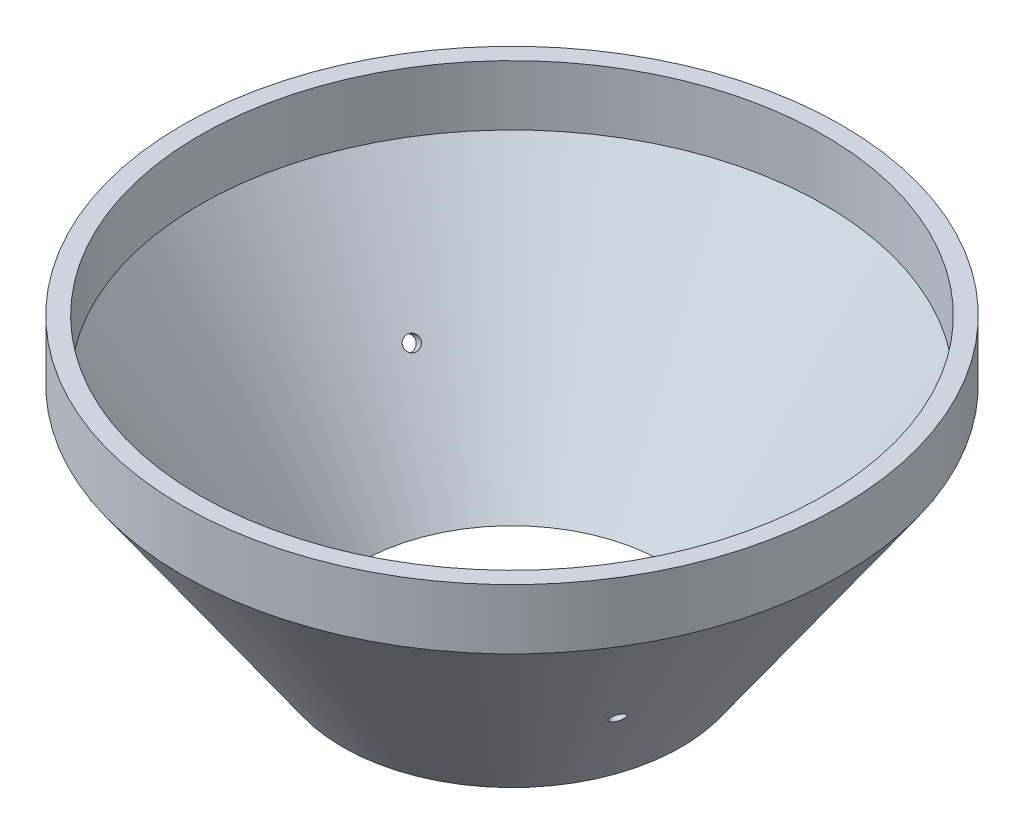
ISO-10303-21;
HEADER;
FILE_DESCRIPTION(('STEP AP214'),'2;1');
FILE_NAME('part.step','',(''),(''),'','','');
FILE_SCHEMA(('AUTOMOTIVE_DESIGN { 1 0 10303 214 1 1 1 1 }'));
ENDSEC;
DATA;
#1=APPLICATION_CONTEXT('core data for automotive mechanical design processes');
#2=APPLICATION_PROTOCOL_DEFINITION('international standard','automotive_design',2000,#1);
#3=PRODUCT_CONTEXT('',#1,'mechanical');
#4=PRODUCT('Part','Part','',(#3));
#5=PRODUCT_RELATED_PRODUCT_CATEGORY('part','',(#4));
#6=PRODUCT_DEFINITION_FORMATION('','',#4);
#7=PRODUCT_DEFINITION_CONTEXT('part definition',#1,'design');
#8=PRODUCT_DEFINITION('design','',#6,#7);
#9=PRODUCT_DEFINITION_SHAPE('','',#8);
#10=(LENGTH_UNIT() NAMED_UNIT(*) SI_UNIT(.MILLI.,.METRE.));
#11=(NAMED_UNIT(*) PLANE_ANGLE_UNIT() SI_UNIT($,.RADIAN.));
#12=(NAMED_UNIT(*) SI_UNIT($,.STERADIAN.) SOLID_ANGLE_UNIT());
#13=UNCERTAINTY_MEASURE_WITH_UNIT(LENGTH_MEASURE(1.E-05),#10,'distance_accuracy_value','');
#14=(GEOMETRIC_REPRESENTATION_CONTEXT(3) GLOBAL_UNCERTAINTY_ASSIGNED_CONTEXT((#13)) GLOBAL_UNIT_ASSIGNED_CONTEXT((#10,
#11,#12)) REPRESENTATION_CONTEXT('',''));
#15=CARTESIAN_POINT('',(0.,0.,0.));
#16=DIRECTION('',(0.,0.,1.));
#17=DIRECTION('',(1.,0.,0.));
#18=AXIS2_PLACEMENT_3D('',#15,#16,#17);
#19=CARTESIAN_POINT('',(0.,5.79928931524201,0.));
#20=DIRECTION('',(0.,1.,0.));
#21=DIRECTION('',(0.,0.,1.));
#22=AXIS2_PLACEMENT_3D('',#19,#20,#21);
#23=PLANE('',#22);
#24=CARTESIAN_POINT('',(0.,5.79928931524201,0.));
#25=DIRECTION('',(0.,-1.,0.));
#26=DIRECTION('',(0.,0.,-1.));
#27=AXIS2_PLACEMENT_3D('',#24,#25,#26);
#28=CIRCLE('',#27,14.0919874006978);
#29=CARTESIAN_POINT('',(0.,5.79928931524201,-14.0919874006978));
#30=VERTEX_POINT('',#29);
#31=EDGE_CURVE('E46',#30,#30,#28,.T.);
#32=ORIENTED_EDGE('',*,*,#31,.T.);
#33=EDGE_LOOP('',(#32));
#34=FACE_BOUND('',#33,.T.);
#35=CARTESIAN_POINT('',(0.,5.79928931524201,0.));
#36=DIRECTION('',(0.,1.,0.));
#37=DIRECTION('',(0.,0.,1.));
#38=AXIS2_PLACEMENT_3D('',#35,#36,#37);
#39=CIRCLE('',#38,12.6270578941841);
#40=CARTESIAN_POINT('',(0.,5.79928931524201,12.6270578941841));
#41=VERTEX_POINT('',#40);
#42=EDGE_CURVE('E50',#41,#41,#39,.F.);
#43=ORIENTED_EDGE('',*,*,#42,.F.);
#44=EDGE_LOOP('',(#43));
#45=FACE_BOUND('',#44,.T.);
#46=ADVANCED_FACE('F33',(#34,#45),#23,.F.);
#47=CARTESIAN_POINT('',(0.,24.8956993484499,0.));
#48=DIRECTION('',(0.,1.,0.));
#49=DIRECTION('',(0.,0.,1.));
#50=AXIS2_PLACEMENT_3D('',#47,#48,#49);
#51=CONICAL_SURFACE('',#50,27.4634376586934,0.610865238198011);
#52=CARTESIAN_POINT('',(-17.5893015558669,14.2993672497077,-9.61096413361605));
#53=CARTESIAN_POINT('',(-17.6035189613711,14.3260236776415,-9.6238708044023));
#54=CARTESIAN_POINT('',(-17.6192554613632,14.3530118601868,-9.63447953581972));
#55=CARTESIAN_POINT('',(-17.6533213465278,14.4068688460513,-9.65078258631254));
#56=CARTESIAN_POINT('',(-17.6716538122646,14.4337374678458,-9.65647100874142));
#57=CARTESIAN_POINT('',(-17.7103672263708,14.4865634435641,-9.66275363933926));
#58=CARTESIAN_POINT('',(-17.7307471865282,14.5125212290129,-9.663350293185));
#59=CARTESIAN_POINT('',(-17.7729644752172,14.5628030126219,-9.65943102159392));
#60=CARTESIAN_POINT('',(-17.7948014448277,14.5871274102116,-9.65491635094159));
#61=CARTESIAN_POINT('',(-17.8393045491599,14.6334809221595,-9.64089410771097));
#62=CARTESIAN_POINT('',(-17.8619708766812,14.6555094981719,-9.63138536721915));
#63=CARTESIAN_POINT('',(-17.9074630256751,14.6966585594308,-9.60763203794173));
#64=CARTESIAN_POINT('',(-17.930288853531,14.7157789275837,-9.59338725854177));
#65=CARTESIAN_POINT('',(-17.9754323914764,14.7505906044923,-9.56055049403012));
#66=CARTESIAN_POINT('',(-17.9977499984155,14.7662812225932,-9.54195763489525));
#67=CARTESIAN_POINT('',(-18.0412163784556,14.7938007318238,-9.50094226255696));
#68=CARTESIAN_POINT('',(-18.0623651543573,14.8056296322071,-9.47851975853055));
#69=CARTESIAN_POINT('',(-18.1028734703736,14.8251037628288,-9.43047335028984));
#70=CARTESIAN_POINT('',(-18.1222331252085,14.8327492614663,-9.40484965158765));
#71=CARTESIAN_POINT('',(-18.1586019426744,14.8436504551491,-9.35112065124473));
#72=CARTESIAN_POINT('',(-18.1756111134505,14.8469061654067,-9.32301535820404));
#73=CARTESIAN_POINT('',(-18.2067863258141,14.8489394102161,-9.26512557139888));
#74=CARTESIAN_POINT('',(-18.2209530627804,14.847718041462,-9.23534149062597));
#75=CARTESIAN_POINT('',(-18.246048606551,14.8408326330705,-9.17493453857342));
#76=CARTESIAN_POINT('',(-18.2569774110083,14.8351685902127,-9.14431166668579));
#77=CARTESIAN_POINT('',(-18.2752962935893,14.8195515994009,-9.08310286903448));
#78=CARTESIAN_POINT('',(-18.2826865417672,14.8095988575947,-9.05251694156582));
#79=CARTESIAN_POINT('',(-18.2937359338752,14.7856744239979,-8.99225655576263));
#80=CARTESIAN_POINT('',(-18.2973950736341,14.7717027277143,-8.96258209844716));
#81=CARTESIAN_POINT('',(-18.300900117043,14.7401167857451,-8.90499047572484));
#82=CARTESIAN_POINT('',(-18.300745170455,14.7225017287474,-8.87707370353265));
#83=CARTESIAN_POINT('',(-18.296648022972,14.6841121545818,-8.82380854343595));
#84=CARTESIAN_POINT('',(-18.2927058176174,14.6633376336937,-8.79846015855581));
#85=CARTESIAN_POINT('',(-18.2811685744619,14.6191964659179,-8.751059338044));
#86=CARTESIAN_POINT('',(-18.2735729813852,14.5958294254108,-8.72900740410549));
#87=CARTESIAN_POINT('',(-18.2549650672113,14.547152436602,-8.68884096571743));
#88=CARTESIAN_POINT('',(-18.243952749952,14.5218424904829,-8.67072645684505));
#89=CARTESIAN_POINT('',(-18.218841797149,14.4699897472089,-8.63896013781421));
#90=CARTESIAN_POINT('',(-18.2047436434253,14.4434471430295,-8.62530763179115));
#91=CARTESIAN_POINT('',(-18.173869366871,14.3898719674803,-8.60285403205953));
#92=CARTESIAN_POINT('',(-18.1570932481387,14.3628393968606,-8.59405293092657));
#93=CARTESIAN_POINT('',(-18.1213447594277,14.3090573027011,-8.58155412537723));
#94=CARTESIAN_POINT('',(-18.1023728914671,14.2823077159827,-8.57785525691703));
#95=CARTESIAN_POINT('',(-18.0627613826868,14.2298501213097,-8.57565832566146));
#96=CARTESIAN_POINT('',(-18.0421217414195,14.2041421136349,-8.57716026426245));
#97=CARTESIAN_POINT('',(-17.9997447380059,14.1545071610063,-8.58531476407548));
#98=CARTESIAN_POINT('',(-17.9780073157683,14.1305803137295,-8.59196760752949));
#99=CARTESIAN_POINT('',(-17.9340319249287,14.0852038831406,-8.61022474784022));
#100=CARTESIAN_POINT('',(-17.9117939552348,14.0637543052344,-8.62182905550154));
#101=CARTESIAN_POINT('',(-17.8674182578462,14.0239544597708,-8.64965118023342));
#102=CARTESIAN_POINT('',(-17.8452805573542,14.0056049893608,-8.66587018103622));
#103=CARTESIAN_POINT('',(-17.8017141995119,13.9725523909275,-8.70244764030438));
#104=CARTESIAN_POINT('',(-17.780285541653,13.9578492602881,-8.7228060958));
#105=CARTESIAN_POINT('',(-17.7387212560724,13.9325241535497,-8.76707446907796));
#106=CARTESIAN_POINT('',(-17.7185856967921,13.9219023933223,-8.79098457462134));
#107=CARTESIAN_POINT('',(-17.6801623775481,13.9050573672074,-8.84166758102289));
#108=CARTESIAN_POINT('',(-17.6618746178109,13.898834101859,-8.86844048223203));
#109=CARTESIAN_POINT('',(-17.6276592744664,13.8909729578077,-8.92407625724281));
#110=CARTESIAN_POINT('',(-17.6117311216332,13.8893339714927,-8.95293862447736));
#111=CARTESIAN_POINT('',(-17.582678972686,13.8906872501671,-9.01193798450284));
#112=CARTESIAN_POINT('',(-17.5695549792523,13.8936795195828,-9.042074978512));
#113=CARTESIAN_POINT('',(-17.546490868914,13.9042050889841,-9.10276646151237));
#114=CARTESIAN_POINT('',(-17.5365503196698,13.9117377719408,-9.13332089322371));
#115=CARTESIAN_POINT('',(-17.5201463873378,13.9311186399565,-9.19398997318723));
#116=CARTESIAN_POINT('',(-17.5136828729936,13.9429666620852,-9.22410463799862));
#117=CARTESIAN_POINT('',(-17.5044349174837,13.9706270414056,-9.28305339933476));
#118=CARTESIAN_POINT('',(-17.5016507439055,13.9864396868331,-9.31188740257341));
#119=CARTESIAN_POINT('',(-17.499865193245,14.0215668326574,-9.36747457159952));
#120=CARTESIAN_POINT('',(-17.5008647571347,14.0408822030045,-9.39422721808912));
#121=CARTESIAN_POINT('',(-17.5066459671973,14.0824558180808,-9.44491339057935));
#122=CARTESIAN_POINT('',(-17.5114302677993,14.1047161191121,-9.46884492444918));
#123=CARTESIAN_POINT('',(-17.5246699881199,14.1515029739417,-9.51317992771398));
#124=CARTESIAN_POINT('',(-17.5331210035721,14.1760267811994,-9.53358758881745));
#125=CARTESIAN_POINT('',(-17.5496577154641,14.2171697450197,-9.56346074164448));
#126=CARTESIAN_POINT('',(-17.5567032411223,14.2333242202383,-9.5741678937775));
#127=CARTESIAN_POINT('',(-17.5720672269729,14.2660647242499,-9.59387264243736));
#128=CARTESIAN_POINT('',(-17.5803856871569,14.2826507530401,-9.60287023897548));
#129=CARTESIAN_POINT('',(-17.5893015558669,14.2993672497077,-9.61096413361605));
#130=B_SPLINE_CURVE_WITH_KNOTS('',3,(#52,#53,#54,#55,#56,#57,#58,#59,#60,#61,#62,#63,#64,#65,
#66,#67,#68,#69,#70,#71,#72,#73,#74,#75,#76,#77,#78,#79,#80,#81,#82,#83,#84,#85,#86,#87,#88,#89,
#90,#91,#92,#93,#94,#95,#96,#97,#98,#99,#100,#101,#102,#103,#104,#105,#106,#107,#108,#109,#110,
#111,#112,#113,#114,#115,#116,#117,#118,#119,#120,#121,#122,#123,#124,#125,#126,#127,#128,#129),
.UNSPECIFIED.,.T.,.F.,(4,2,2,2,2,2,2,2,2,2,2,2,2,2,2,2,2,2,2,2,2,2,2,2,2,2,2,2,2,2,2,2,2,2,2,2,
2,2,4),(0.,0.0984820921772583,0.197082045382401,0.295634636419945,0.394163038921912,
0.492714493549843,0.591269915121153,0.689845164727733,0.788420178121206,0.886988866388851,
0.985557213076688,1.08410141632164,1.1826456909979,1.28118522940693,1.37972487798188,
1.47828649326707,1.57684822461118,1.67542494101506,1.77400154668906,1.87256277166049,
1.97112384579736,2.06966243009446,2.16820104084814,2.26674505137172,2.36528927692956,
2.46385880326101,2.56242825887658,2.66100292730707,2.75957760782232,2.85812846955568,
2.95667942548179,3.0552169916423,3.15375083779654,3.25229184963217,3.35085736909455,
3.44949207894288,3.5480086404969,3.60976768715793,3.67152673341123),.UNSPECIFIED.);
#131=CARTESIAN_POINT('',(-17.5893015558669,14.2993672497077,-9.61096413361605));
#132=VERTEX_POINT('',#131);
#133=EDGE_CURVE('E10',#132,#132,#130,.T.);
#134=ORIENTED_EDGE('',*,*,#133,.T.);
#135=EDGE_LOOP('',(#134));
#136=FACE_BOUND('',#135,.T.);
#137=CARTESIAN_POINT('',(17.7826076270842,13.9599255134886,8.72132491610677));
#138=CARTESIAN_POINT('',(17.761417325579,13.9458150488873,8.74209327225045));
#139=CARTESIAN_POINT('',(17.7407517081181,13.9336570938814,8.76476119367181));
#140=CARTESIAN_POINT('',(17.7010512031579,13.9136251440984,8.81323943058742));
#141=CARTESIAN_POINT('',(17.6820182942927,13.9057562870442,8.83905346960877));
#142=CARTESIAN_POINT('',(17.6461356415969,13.894554372199,8.89305810424309));
#143=CARTESIAN_POINT('',(17.6292848868808,13.8912192073198,8.92124758936493));
#144=CARTESIAN_POINT('',(17.5982352789959,13.8891799851814,8.97920022828229));
#145=CARTESIAN_POINT('',(17.5840357709389,13.8904747826717,9.00896299112331));
#146=CARTESIAN_POINT('',(17.5586886947375,13.8976535063926,9.06922440148232));
#147=CARTESIAN_POINT('',(17.5475410159581,13.9035372662338,9.09972302228028));
#148=CARTESIAN_POINT('',(17.5286236703916,13.9197184967379,9.16059811999139));
#149=CARTESIAN_POINT('',(17.5208541384105,13.9300161435057,9.19097459198223));
#150=CARTESIAN_POINT('',(17.5089309969258,13.9547199849597,9.25075465122214));
#151=CARTESIAN_POINT('',(17.5047777655659,13.9691266090981,9.28015813642023));
#152=CARTESIAN_POINT('',(17.5002289177343,14.0016212456656,9.33716649683968));
#153=CARTESIAN_POINT('',(17.4998333001482,14.0197092570031,9.36477137259438));
#154=CARTESIAN_POINT('',(17.502836181972,14.0590390888729,9.41741920984108));
#155=CARTESIAN_POINT('',(17.5062356461702,14.0802817101819,9.44246151810824));
#156=CARTESIAN_POINT('',(17.5167582373267,14.1252955497291,9.48927789906822));
#157=CARTESIAN_POINT('',(17.5238813570199,14.1490667630337,9.51105197813746));
#158=CARTESIAN_POINT('',(17.541670063872,14.198446461599,9.5507240262373));
#159=CARTESIAN_POINT('',(17.5523355915562,14.224054916008,9.56862206033562));
#160=CARTESIAN_POINT('',(17.5769216445568,14.276370563895,9.60004165305983));
#161=CARTESIAN_POINT('',(17.5908421676625,14.3030777566268,9.61356321465816));
#162=CARTESIAN_POINT('',(17.6215466735348,14.3568194380453,9.63584664877262));
#163=CARTESIAN_POINT('',(17.6383299272397,14.3838538417755,9.64460973077633));
#164=CARTESIAN_POINT('',(17.6742852512789,14.4374894316883,9.65713238185322));
#165=CARTESIAN_POINT('',(17.6934573192907,14.464090618292,9.66089195579087));
#166=CARTESIAN_POINT('',(17.7336355441271,14.5161090392707,9.66329664229007));
#167=CARTESIAN_POINT('',(17.7546415379011,14.5415263785917,9.66194220907633));
#168=CARTESIAN_POINT('',(17.7978774716603,14.5904707799978,9.65415080202763));
#169=CARTESIAN_POINT('',(17.8201074135599,14.6139978391262,9.64771382024263));
#170=CARTESIAN_POINT('',(17.8651448034105,14.658515454645,9.62992778611012));
#171=CARTESIAN_POINT('',(17.887952372316,14.6795054743804,9.61857769682047));
#172=CARTESIAN_POINT('',(17.9334700740061,14.7183663758969,9.59127538226466));
#173=CARTESIAN_POINT('',(17.9561802066764,14.736237254022,9.57532315160436));
#174=CARTESIAN_POINT('',(18.0008392303687,14.7683744438443,9.53925358945914));
#175=CARTESIAN_POINT('',(18.0227879823384,14.7826401000727,9.51913550178382));
#176=CARTESIAN_POINT('',(18.0652755303943,14.8071742615771,9.47529588973369));
#177=CARTESIAN_POINT('',(18.0858143276063,14.8174427700448,9.45157436823627));
#178=CARTESIAN_POINT('',(18.1248795994033,14.8337029087461,9.40119578413134));
#179=CARTESIAN_POINT('',(18.1434063226943,14.8396950680769,9.37453908515393));
#180=CARTESIAN_POINT('',(18.1779138710204,14.8472422115966,9.31903938105916));
#181=CARTESIAN_POINT('',(18.1938947004417,14.8487972034302,9.29019637970864));
#182=CARTESIAN_POINT('',(18.222850408032,14.8474280946604,9.23114882744394));
#183=CARTESIAN_POINT('',(18.2358259917048,14.8445050465397,9.20094459808121));
#184=CARTESIAN_POINT('',(18.2584128786622,14.834260926308,9.14002832362521));
#185=CARTESIAN_POINT('',(18.2680241802727,14.8269398520085,9.10931627827925));
#186=CARTESIAN_POINT('',(18.2836224135645,14.8080978845851,9.04826186579858));
#187=CARTESIAN_POINT('',(18.289609292618,14.7965769304815,9.01791950403808));
#188=CARTESIAN_POINT('',(18.2978071992307,14.769647963822,8.95847496525789));
#189=CARTESIAN_POINT('',(18.3000182245214,14.7542399489307,8.92937278898334));
#190=CARTESIAN_POINT('',(18.3006242672265,14.7199523045087,8.87323843208837));
#191=CARTESIAN_POINT('',(18.2990183640124,14.7010718384493,8.84620675248705));
#192=CARTESIAN_POINT('',(18.2920580989521,14.6603585443954,8.79500015656258));
#193=CARTESIAN_POINT('',(18.2867037278306,14.6385257090955,8.77082524730844));
#194=CARTESIAN_POINT('',(18.2724204674638,14.5925068136397,8.72602778281772));
#195=CARTESIAN_POINT('',(18.2634912334733,14.5683205266966,8.70540557046327));
#196=CARTESIAN_POINT('',(18.2423307895703,14.5182677338638,8.66831188708996));
#197=CARTESIAN_POINT('',(18.2300995776714,14.4924012269632,8.65184041856821));
#198=CARTESIAN_POINT('',(18.2026984118629,14.4397166995921,8.6235257998232));
#199=CARTESIAN_POINT('',(18.1875289935138,14.4128988532532,8.61168180731366));
#200=CARTESIAN_POINT('',(18.15468745815,14.3590649250195,8.59295795168092));
#201=CARTESIAN_POINT('',(18.1370154421487,14.3320488511675,8.58607788826505));
#202=CARTESIAN_POINT('',(18.0996739448123,14.2785943249739,8.57747651459002));
#203=CARTESIAN_POINT('',(18.0800050598908,14.2521557030123,8.57575366866134));
#204=CARTESIAN_POINT('',(18.0392077778918,14.2005987947448,8.57750668555072));
#205=CARTESIAN_POINT('',(18.0180790201865,14.1754808373964,8.58098383731894));
#206=CARTESIAN_POINT('',(17.9749389724588,14.1272862309115,8.59303268494288));
#207=CARTESIAN_POINT('',(17.9529271679205,14.104210797732,8.60160739235389));
#208=CARTESIAN_POINT('',(17.9086516204331,14.060808594704,8.62359440828659));
#209=CARTESIAN_POINT('',(17.8863882097973,14.0404785748033,8.63700092660288));
#210=CARTESIAN_POINT('',(17.8504575802043,14.0101137677797,8.66240864798434));
#211=CARTESIAN_POINT('',(17.8366788529878,13.9990657652539,8.67307160456029));
#212=CARTESIAN_POINT('',(17.8094004656271,13.9783975523432,8.69601549725871));
#213=CARTESIAN_POINT('',(17.7959008055791,13.9687773424513,8.70829643394015));
#214=CARTESIAN_POINT('',(17.7826076270842,13.9599255134886,8.72132491610677));
#215=B_SPLINE_CURVE_WITH_KNOTS('',3,(#137,#138,#139,#140,#141,#142,#143,#144,#145,#146,#147,
#148,#149,#150,#151,#152,#153,#154,#155,#156,#157,#158,#159,#160,#161,#162,#163,#164,#165,#166,
#167,#168,#169,#170,#171,#172,#173,#174,#175,#176,#177,#178,#179,#180,#181,#182,#183,#184,#185,
#186,#187,#188,#189,#190,#191,#192,#193,#194,#195,#196,#197,#198,#199,#200,#201,#202,#203,#204,
#205,#206,#207,#208,#209,#210,#211,#212,#213,#214),.UNSPECIFIED.,.T.,.F.,(4,2,2,2,2,2,2,2,2,2,2,
2,2,2,2,2,2,2,2,2,2,2,2,2,2,2,2,2,2,2,2,2,2,2,2,2,2,2,4),(0.,0.098490160582042,0.19709804039536,
0.295660075321499,0.394197731993226,0.492731815995366,0.59126983166936,0.689818149878481,
0.788366438864264,0.886939786571135,0.985512941956048,1.08408444245123,1.18265587599811,
1.28120224338834,1.37974851497085,1.47828603390666,1.57682370697392,1.6753821871828,
1.77394078291176,1.87251728480033,1.97109370797474,2.06965793253064,2.16822198727174,
2.26676287985837,2.36530382148115,2.46384619391838,2.5623886255619,2.66095482767592,
2.75952127368449,2.85809722733248,2.9566732402843,3.05523130220903,3.15378538713027,
3.25231012258767,3.35085928392604,3.44946672449045,3.54795638950444,3.60974158080983,
3.67152679345996),.UNSPECIFIED.);
#216=CARTESIAN_POINT('',(17.7826076270842,13.9599255134886,8.72132491610677));
#217=VERTEX_POINT('',#216);
#218=EDGE_CURVE('E42',#217,#217,#215,.T.);
#219=ORIENTED_EDGE('',*,*,#218,.T.);
#220=EDGE_LOOP('',(#219));
#221=FACE_BOUND('',#220,.T.);
#222=ORIENTED_EDGE('',*,*,#31,.F.);
#223=EDGE_LOOP('',(#222));
#224=FACE_BOUND('',#223,.T.);
#225=CARTESIAN_POINT('',(0.,24.8956993484499,0.));
#226=DIRECTION('',(0.,1.,0.));
#227=DIRECTION('',(0.,0.,1.));
#228=AXIS2_PLACEMENT_3D('',#225,#226,#227);
#229=CIRCLE('',#228,27.4634376586934);
#230=CARTESIAN_POINT('',(0.,24.8956993484499,27.4634376586934));
#231=VERTEX_POINT('',#230);
#232=EDGE_CURVE('E112',#231,#231,#229,.T.);
#233=ORIENTED_EDGE('',*,*,#232,.F.);
#234=EDGE_LOOP('',(#233));
#235=FACE_BOUND('',#234,.T.);
#236=ADVANCED_FACE('F56',(#136,#221,#224,#235),#51,.T.);
#237=CARTESIAN_POINT('',(0.,30.0573576436351,0.));
#238=DIRECTION('',(0.,1.,0.));
#239=DIRECTION('',(0.,0.,1.));
#240=AXIS2_PLACEMENT_3D('',#237,#238,#239);
#241=CONICAL_SURFACE('',#240,29.612740200131,0.610865238198011);
#242=CARTESIAN_POINT('',(-17.1760510044606,14.9054792942478,-8.13067965215727));
#243=CARTESIAN_POINT('',(-17.1555026675167,14.8798787256553,-8.1321915607195));
#244=CARTESIAN_POINT('',(-17.134250068723,14.8549661100555,-8.13629890649272));
#245=CARTESIAN_POINT('',(-17.0909302941707,14.8072570960029,-8.1495894407266));
#246=CARTESIAN_POINT('',(-17.0688621705865,14.7844632755552,-8.15877872050081));
#247=CARTESIAN_POINT('',(-17.0245397102006,14.7416893927237,-8.18195726269472));
#248=CARTESIAN_POINT('',(-17.0022854684999,14.7217079764536,-8.1959442043061));
#249=CARTESIAN_POINT('',(-16.9581934025651,14.685141333883,-8.22830492294172));
#250=CARTESIAN_POINT('',(-16.9363554766953,14.6685552687872,-8.24667761406527));
#251=CARTESIAN_POINT('',(-16.8936792514352,14.6392600659036,-8.28728160039637));
#252=CARTESIAN_POINT('',(-16.8728411481319,14.6265516860161,-8.30951364859159));
#253=CARTESIAN_POINT('',(-16.8327381058243,14.6053944691828,-8.35719280345823));
#254=CARTESIAN_POINT('',(-16.8134732259191,14.5969457921938,-8.38264003081857));
#255=CARTESIAN_POINT('',(-16.7770531223324,14.5845627816874,-8.43601218238577));
#256=CARTESIAN_POINT('',(-16.7598974159182,14.5806274134722,-8.46393653711705));
#257=CARTESIAN_POINT('',(-16.7281702048726,14.5773855532317,-8.52147101271956));
#258=CARTESIAN_POINT('',(-16.7135986909604,14.5780790445822,-8.5510811275361));
#259=CARTESIAN_POINT('',(-16.687458123619,14.5840733289283,-8.61113971143332));
#260=CARTESIAN_POINT('',(-16.6758883569768,14.5893730261888,-8.64158797946424));
#261=CARTESIAN_POINT('',(-16.6560851689829,14.604419490487,-8.7024705961569));
#262=CARTESIAN_POINT('',(-16.6478517443689,14.6141662531763,-8.73290494483222));
#263=CARTESIAN_POINT('',(-16.6349716679898,14.6378172690177,-8.79290889810271));
#264=CARTESIAN_POINT('',(-16.6303254231638,14.6517219936117,-8.82247840422193));
#265=CARTESIAN_POINT('',(-16.6247761641241,14.6832755256736,-8.87992249166004));
#266=CARTESIAN_POINT('',(-16.6238731611076,14.7009243443408,-8.90779706790871));
#267=CARTESIAN_POINT('',(-16.6258623624878,14.73945051249,-8.96108186325244));
#268=CARTESIAN_POINT('',(-16.6287556491608,14.760328781152,-8.98649137736993));
#269=CARTESIAN_POINT('',(-16.638283210844,14.8046975996559,-9.03412920207795));
#270=CARTESIAN_POINT('',(-16.6449174842954,14.8281881484092,-9.05635751399415));
#271=CARTESIAN_POINT('',(-16.6617616366448,14.877097455177,-9.09701350012439));
#272=CARTESIAN_POINT('',(-16.6719715374895,14.9025162250257,-9.11544115100959));
#273=CARTESIAN_POINT('',(-16.695694061218,14.9545470396533,-9.14798057544822));
#274=CARTESIAN_POINT('',(-16.7092066783073,14.9811590823386,-9.1620923565736));
#275=CARTESIAN_POINT('',(-16.7391559016572,15.0348059832063,-9.18560033870678));
#276=CARTESIAN_POINT('',(-16.7555916980513,15.0618407223934,-9.1949978430566));
#277=CARTESIAN_POINT('',(-16.7909236321293,15.1155721444589,-9.20881653106291));
#278=CARTESIAN_POINT('',(-16.8098197677839,15.142268827616,-9.21323771882405));
#279=CARTESIAN_POINT('',(-16.8495253957779,15.1945693260324,-9.21697419778987));
#280=CARTESIAN_POINT('',(-16.8703346572179,15.2201732726317,-9.21629010436545));
#281=CARTESIAN_POINT('',(-16.9132624703224,15.2695775508249,-9.20982941345751));
#282=CARTESIAN_POINT('',(-16.9353810240015,15.2933778796436,-9.20405280813829));
#283=CARTESIAN_POINT('',(-16.9802838448603,15.3385216414282,-9.18755869045187));
#284=CARTESIAN_POINT('',(-17.0030682572674,15.3598645333238,-9.17684009256264));
#285=CARTESIAN_POINT('',(-17.0486274790224,15.3995013383736,-9.15075338093293));
#286=CARTESIAN_POINT('',(-17.0714022883577,15.4177952475066,-9.13538526106022));
#287=CARTESIAN_POINT('',(-17.1162762379473,15.4508384258929,-9.10041876279394));
#288=CARTESIAN_POINT('',(-17.1383752310958,15.4655869281391,-9.08081947077366));
#289=CARTESIAN_POINT('',(-17.1812422919261,15.4911333569676,-9.03793691973593));
#290=CARTESIAN_POINT('',(-17.2020103601237,15.5019312850812,-9.01465366214638));
#291=CARTESIAN_POINT('',(-17.2416052597306,15.5192830258669,-8.96505752422758));
#292=CARTESIAN_POINT('',(-17.2604323154458,15.5258373294013,-8.9387449947106));
#293=CARTESIAN_POINT('',(-17.2956013989806,15.5345265764428,-8.88382926756963));
#294=CARTESIAN_POINT('',(-17.3119434338781,15.5366615325375,-8.85522607647036));
#295=CARTESIAN_POINT('',(-17.3416703932252,15.5364544733434,-8.79654723517398));
#296=CARTESIAN_POINT('',(-17.3550561013066,15.5341136460404,-8.76647197776496));
#297=CARTESIAN_POINT('',(-17.3785003178667,15.5250205795087,-8.7056979619773));
#298=CARTESIAN_POINT('',(-17.3885588205471,15.5182683325923,-8.67499920251217));
#299=CARTESIAN_POINT('',(-17.40507529652,15.5005349904593,-8.61385596788646));
#300=CARTESIAN_POINT('',(-17.4115333046257,15.4895539361328,-8.58341149027002));
#301=CARTESIAN_POINT('',(-17.4206845496644,15.4636602396957,-8.52364944239785));
#302=CARTESIAN_POINT('',(-17.4233777724409,15.4487475828016,-8.49433187638));
#303=CARTESIAN_POINT('',(-17.4249464718857,15.4153910382316,-8.43765878367488));
#304=CARTESIAN_POINT('',(-17.4238208799281,15.3969461634914,-8.41030380837007));
#305=CARTESIAN_POINT('',(-17.4178066634316,15.357032161424,-8.35835466718444));
#306=CARTESIAN_POINT('',(-17.4129181821677,15.3355631492686,-8.33376039622847));
#307=CARTESIAN_POINT('',(-17.3995412290851,15.2901897610013,-8.28804107455498));
#308=CARTESIAN_POINT('',(-17.3910526633136,15.2662853213436,-8.26691611439734));
#309=CARTESIAN_POINT('',(-17.3707339195299,15.2166962716827,-8.22874191100964));
#310=CARTESIAN_POINT('',(-17.3589029210994,15.1910112257895,-8.21169367033191));
#311=CARTESIAN_POINT('',(-17.3322501191545,15.1385801344522,-8.18216821082243));
#312=CARTESIAN_POINT('',(-17.3174275116045,15.1118338053296,-8.16969222338951));
#313=CARTESIAN_POINT('',(-17.2852322546683,15.0580605076181,-8.14968774918427));
#314=CARTESIAN_POINT('',(-17.2678626821898,15.0310339137128,-8.14215335191033));
#315=CARTESIAN_POINT('',(-17.2379550449643,14.9874839757512,-8.13407851099931));
#316=CARTESIAN_POINT('',(-17.2260352909679,14.9708076821694,-8.13197692720889));
#317=CARTESIAN_POINT('',(-17.2015194849561,14.9378240316364,-8.12980393341311));
#318=CARTESIAN_POINT('',(-17.1889234331761,14.9215166745568,-8.12973252270125));
#319=CARTESIAN_POINT('',(-17.1760510044606,14.9054792942478,-8.13067965215727));
#320=B_SPLINE_CURVE_WITH_KNOTS('',3,(#242,#243,#244,#245,#246,#247,#248,#249,#250,#251,#252,
#253,#254,#255,#256,#257,#258,#259,#260,#261,#262,#263,#264,#265,#266,#267,#268,#269,#270,#271,
#272,#273,#274,#275,#276,#277,#278,#279,#280,#281,#282,#283,#284,#285,#286,#287,#288,#289,#290,
#291,#292,#293,#294,#295,#296,#297,#298,#299,#300,#301,#302,#303,#304,#305,#306,#307,#308,#309,
#310,#311,#312,#313,#314,#315,#316,#317,#318,#319),.UNSPECIFIED.,.T.,.F.,(4,2,2,2,2,2,2,2,2,2,2,
2,2,2,2,2,2,2,2,2,2,2,2,2,2,2,2,2,2,2,2,2,2,2,2,2,2,2,4),(0.,0.0985107645104439,
0.197139862829302,0.29572131769567,0.394278389309699,0.492854711757413,0.591434735587509,
0.689992154950169,0.788549220349731,0.887082847179519,0.985616377662781,1.0841610844044,
1.18270608591981,1.28127918752814,1.37985224805892,1.47842591362312,1.57699940624462,
1.67554563150702,1.77409177548452,1.87262604128196,1.97116045869163,2.06971652977088,
2.16827273083571,2.26685023422505,2.36542769940617,2.46399376004377,2.56255953993602,
2.66109916161474,2.75963895501788,2.85817779562249,2.95671700675756,3.05528379457481,
3.15384682956946,3.25241243695903,3.35100225886434,3.44961861349261,3.54811679962959,
3.60982852056446,3.67154022002425),.UNSPECIFIED.);
#321=CARTESIAN_POINT('',(-17.1760510044606,14.9054792942478,-8.13067965215727));
#322=VERTEX_POINT('',#321);
#323=EDGE_CURVE('E77',#322,#322,#320,.T.);
#324=ORIENTED_EDGE('',*,*,#323,.F.);
#325=EDGE_LOOP('',(#324));
#326=FACE_BOUND('',#325,.T.);
#327=CARTESIAN_POINT('',(16.670154658525,14.593926043726,8.65950395337578));
#328=CARTESIAN_POINT('',(16.659807244681,14.6008351963677,8.68991800208535));
#329=CARTESIAN_POINT('',(16.6510974512613,14.6099844282372,8.72040607858555));
#330=CARTESIAN_POINT('',(16.637230858941,14.632496263906,8.78065528014094));
#331=CARTESIAN_POINT('',(16.6320783399014,14.645863914946,8.81041548811746));
#332=CARTESIAN_POINT('',(16.6255077704856,14.6764056021376,8.86833779258368));
#333=CARTESIAN_POINT('',(16.6240879096503,14.6935777885834,8.89650065734805));
#334=CARTESIAN_POINT('',(16.6250450315212,14.7312193233967,8.95044754575044));
#335=CARTESIAN_POINT('',(16.627421076802,14.7516878565861,8.97623215505198));
#336=CARTESIAN_POINT('',(16.6359276311845,14.7953296273028,9.02471927635114));
#337=CARTESIAN_POINT('',(16.6420590380491,14.8185035105029,9.04742104977514));
#338=CARTESIAN_POINT('',(16.6579269548307,14.8668771828799,9.0891030067931));
#339=CARTESIAN_POINT('',(16.6676636013638,14.8920770488005,9.10808304931517));
#340=CARTESIAN_POINT('',(16.6904814470885,14.9437681420784,9.14178735843746));
#341=CARTESIAN_POINT('',(16.7035620700686,14.9702591463196,9.156512357308));
#342=CARTESIAN_POINT('',(16.732707580925,15.0237761727142,9.18129764767024));
#343=CARTESIAN_POINT('',(16.7487724576575,15.0508021928694,9.19135795658015));
#344=CARTESIAN_POINT('',(16.7834273354773,15.1046132203325,9.20652698811809));
#345=CARTESIAN_POINT('',(16.802016671366,15.1313982891557,9.21163701227778));
#346=CARTESIAN_POINT('',(16.8411890211298,15.183979668531,9.21676173058662));
#347=CARTESIAN_POINT('',(16.8617720319908,15.2097759805779,9.2167764324389));
#348=CARTESIAN_POINT('',(16.9043338473879,15.2596603810243,9.21170297991059));
#349=CARTESIAN_POINT('',(16.9263127073336,15.2837484015311,9.20661462284025));
#350=CARTESIAN_POINT('',(16.9710215087795,15.3295481445816,9.19146901971588));
#351=CARTESIAN_POINT('',(16.9937514524748,15.3512598601796,9.1814117591387));
#352=CARTESIAN_POINT('',(17.0393000433642,15.3917159849988,9.15659798929557));
#353=CARTESIAN_POINT('',(17.0621187133794,15.4104595708333,9.1418401794611));
#354=CARTESIAN_POINT('',(17.1071660641212,15.4444601578908,9.10803198471974));
#355=CARTESIAN_POINT('',(17.1293947447465,15.4597171585157,9.08898159907645));
#356=CARTESIAN_POINT('',(17.1726099638119,15.4863309780419,9.04711483568012));
#357=CARTESIAN_POINT('',(17.1935963941562,15.4976874579469,9.0242981308493));
#358=CARTESIAN_POINT('',(17.2337100550888,15.5161905979683,8.97553770528047));
#359=CARTESIAN_POINT('',(17.2528372883486,15.5233372641338,8.94959398903574));
#360=CARTESIAN_POINT('',(17.2886723349828,15.5332263478403,8.89531601434548));
#361=CARTESIAN_POINT('',(17.3053807066441,15.5359697831511,8.8669823099198));
#362=CARTESIAN_POINT('',(17.3359037102013,15.5369814842108,8.80872118947463));
#363=CARTESIAN_POINT('',(17.3497183459911,15.5352497559816,8.77879377559978));
#364=CARTESIAN_POINT('',(17.3740624825537,15.5273586782654,8.71820258536537));
#365=CARTESIAN_POINT('',(17.3845926121458,15.5212001770318,8.68753895116748));
#366=CARTESIAN_POINT('',(17.4020837530353,15.5046228879403,8.62634563334622));
#367=CARTESIAN_POINT('',(17.409044760764,15.4942040958228,8.59581594985681));
#368=CARTESIAN_POINT('',(17.4192188953895,15.469386437727,8.53576136877281));
#369=CARTESIAN_POINT('',(17.4224314945513,15.4549870116721,8.506236613229));
#370=CARTESIAN_POINT('',(17.4250386820125,15.4225996546325,8.44904519474075));
#371=CARTESIAN_POINT('',(17.4244332640448,15.4046117177575,8.42137853484639));
#372=CARTESIAN_POINT('',(17.4194458964768,15.3655328383246,8.36869371609872));
#373=CARTESIAN_POINT('',(17.4150629722597,15.344441096133,8.34367624262035));
#374=CARTESIAN_POINT('',(17.4026681128534,15.2997370547253,8.29702046471274));
#375=CARTESIAN_POINT('',(17.3946561767434,15.2761247548697,8.27538216114088));
#376=CARTESIAN_POINT('',(17.3752522138766,15.2270331969878,8.2361105583269));
#377=CARTESIAN_POINT('',(17.3638602606037,15.2015539795587,8.2184771720299));
#378=CARTESIAN_POINT('',(17.338035528095,15.1494389091751,8.18772407651576));
#379=CARTESIAN_POINT('',(17.3236027578389,15.1228030596364,8.17460435396969));
#380=CARTESIAN_POINT('',(17.2921192855479,15.0691317971625,8.15325881883099));
#381=CARTESIAN_POINT('',(17.2750693045287,15.0420964961203,8.14503166141838));
#382=CARTESIAN_POINT('',(17.2388328883802,14.9883865581651,8.13369934447795));
#383=CARTESIAN_POINT('',(17.219646450923,14.9617119216452,8.13059419053138));
#384=CARTESIAN_POINT('',(17.1796757592579,14.9094899580398,8.12958959055458));
#385=CARTESIAN_POINT('',(17.1588916753433,14.8839425112626,8.13168959044968));
#386=CARTESIAN_POINT('',(17.116297529526,14.8347091853461,8.14102593547253));
#387=CARTESIAN_POINT('',(17.0944874639257,14.8110233129169,8.14826229911357));
#388=CARTESIAN_POINT('',(17.0504323110419,14.7661964999897,8.1676569660985));
#389=CARTESIAN_POINT('',(17.0281871157617,14.7450562008488,8.17981650648411));
#390=CARTESIAN_POINT('',(16.9838731343598,14.7059479150965,8.20869895259479));
#391=CARTESIAN_POINT('',(16.9618043416441,14.6879798093741,8.22542168691871));
#392=CARTESIAN_POINT('',(16.9184397996345,14.655743501449,8.26294484070288));
#393=CARTESIAN_POINT('',(16.8971441302045,14.6414756805567,8.28374568002001));
#394=CARTESIAN_POINT('',(16.8559032352826,14.6170633076099,8.32882850366576));
#395=CARTESIAN_POINT('',(16.8359583433074,14.6069197708001,8.35311134314524));
#396=CARTESIAN_POINT('',(16.7979682861503,14.591060898358,8.40445992352643));
#397=CARTESIAN_POINT('',(16.7799237385134,14.585346998388,8.43152656345189));
#398=CARTESIAN_POINT('',(16.7462581114769,14.5785304082345,8.48764214623906));
#399=CARTESIAN_POINT('',(16.7306341529278,14.5774221986762,8.51668867396577));
#400=CARTESIAN_POINT('',(16.7075487573846,14.5793781841744,8.56485254386883));
#401=CARTESIAN_POINT('',(16.6992181900523,14.5810385894668,8.58362640069534));
#402=CARTESIAN_POINT('',(16.6837623888797,14.5861482804993,8.62142513798526));
#403=CARTESIAN_POINT('',(16.6766371545881,14.5895975655696,8.64045001835468));
#404=CARTESIAN_POINT('',(16.670154658525,14.593926043726,8.65950395337578));
#405=B_SPLINE_CURVE_WITH_KNOTS('',3,(#327,#328,#329,#330,#331,#332,#333,#334,#335,#336,#337,
#338,#339,#340,#341,#342,#343,#344,#345,#346,#347,#348,#349,#350,#351,#352,#353,#354,#355,#356,
#357,#358,#359,#360,#361,#362,#363,#364,#365,#366,#367,#368,#369,#370,#371,#372,#373,#374,#375,
#376,#377,#378,#379,#380,#381,#382,#383,#384,#385,#386,#387,#388,#389,#390,#391,#392,#393,#394,
#395,#396,#397,#398,#399,#400,#401,#402,#403,#404),.UNSPECIFIED.,.T.,.F.,(4,2,2,2,2,2,2,2,2,2,2,
2,2,2,2,2,2,2,2,2,2,2,2,2,2,2,2,2,2,2,2,2,2,2,2,2,2,2,4),(0.,0.0985066790961336,
0.197131668892531,0.295708813568137,0.394261617694252,0.492837991212628,0.591418100537751,
0.689981234634621,0.788544000688529,0.887080845525231,0.985617541393126,1.08415815122105,
1.18269904906581,1.28126723535565,1.37983543855493,1.47841220620265,1.57698883220473,
1.67554266976468,1.77409637470536,1.87263119992517,1.97116612366643,2.06971491837281,
2.16826387484399,2.26683826509068,2.36541268034825,2.46398495268893,2.56255693394117,
2.66110180816236,2.75964678976405,2.85818128196712,2.95671612932527,3.05527575081697,
3.15383167075509,3.25239774274482,3.35098806335083,3.44961032411453,3.5481143636334,
3.60982731028502,3.6715402338279),.UNSPECIFIED.);
#406=CARTESIAN_POINT('',(16.670154658525,14.593926043726,8.65950395337578));
#407=VERTEX_POINT('',#406);
#408=EDGE_CURVE('E70',#407,#407,#405,.T.);
#409=ORIENTED_EDGE('',*,*,#408,.F.);
#410=EDGE_LOOP('',(#409));
#411=FACE_BOUND('',#410,.T.);
#412=CARTESIAN_POINT('',(0.,24.8956993484499,0.));
#413=DIRECTION('',(0.,1.,0.));
#414=DIRECTION('',(0.,0.,1.));
#415=AXIS2_PLACEMENT_3D('',#412,#413,#414);
#416=CIRCLE('',#415,25.9985081521796);
#417=CARTESIAN_POINT('',(0.,24.8956993484499,25.9985081521796));
#418=VERTEX_POINT('',#417);
#419=EDGE_CURVE('E80',#418,#418,#416,.T.);
#420=ORIENTED_EDGE('',*,*,#419,.T.);
#421=EDGE_LOOP('',(#420));
#422=FACE_BOUND('',#421,.T.);
#423=ORIENTED_EDGE('',*,*,#42,.T.);
#424=EDGE_LOOP('',(#423));
#425=FACE_BOUND('',#424,.T.);
#426=ADVANCED_FACE('F82',(#326,#411,#422,#425),#241,.F.);
#427=CARTESIAN_POINT('',(0.,29.8956993484499,0.));
#428=DIRECTION('',(0.,-1.,0.));
#429=DIRECTION('',(0.,0.,-1.));
#430=AXIS2_PLACEMENT_3D('',#427,#428,#429);
#431=CYLINDRICAL_SURFACE('',#430,27.4634376586934);
#432=CARTESIAN_POINT('',(0.,29.8956993484499,0.));
#433=DIRECTION('',(0.,1.,0.));
#434=DIRECTION('',(0.,0.,1.));
#435=AXIS2_PLACEMENT_3D('',#432,#433,#434);
#436=CIRCLE('',#435,27.4634376586934);
#437=CARTESIAN_POINT('',(0.,29.8956993484499,27.4634376586934));
#438=VERTEX_POINT('',#437);
#439=EDGE_CURVE('E110',#438,#438,#436,.T.);
#440=ORIENTED_EDGE('',*,*,#439,.F.);
#441=EDGE_LOOP('',(#440));
#442=FACE_BOUND('',#441,.T.);
#443=ORIENTED_EDGE('',*,*,#232,.T.);
#444=EDGE_LOOP('',(#443));
#445=FACE_BOUND('',#444,.T.);
#446=ADVANCED_FACE('F86',(#442,#445),#431,.T.);
#447=CARTESIAN_POINT('',(0.,29.8956993484499,0.));
#448=DIRECTION('',(0.,1.,0.));
#449=DIRECTION('',(0.,0.,1.));
#450=AXIS2_PLACEMENT_3D('',#447,#448,#449);
#451=PLANE('',#450);
#452=CARTESIAN_POINT('',(0.,29.8956993484499,0.));
#453=DIRECTION('',(0.,1.,0.));
#454=DIRECTION('',(0.,0.,1.));
#455=AXIS2_PLACEMENT_3D('',#452,#453,#454);
#456=CIRCLE('',#455,25.9985081521796);
#457=CARTESIAN_POINT('',(0.,29.8956993484499,25.9985081521796));
#458=VERTEX_POINT('',#457);
#459=EDGE_CURVE('E76',#458,#458,#456,.T.);
#460=ORIENTED_EDGE('',*,*,#459,.F.);
#461=EDGE_LOOP('',(#460));
#462=FACE_BOUND('',#461,.T.);
#463=ORIENTED_EDGE('',*,*,#439,.T.);
#464=EDGE_LOOP('',(#463));
#465=FACE_BOUND('',#464,.T.);
#466=ADVANCED_FACE('F90',(#462,#465),#451,.T.);
#467=CARTESIAN_POINT('',(0.,24.8956993484499,0.));
#468=DIRECTION('',(0.,1.,0.));
#469=DIRECTION('',(0.,0.,1.));
#470=AXIS2_PLACEMENT_3D('',#467,#468,#469);
#471=CYLINDRICAL_SURFACE('',#470,25.9985081521796);
#472=ORIENTED_EDGE('',*,*,#419,.F.);
#473=EDGE_LOOP('',(#472));
#474=FACE_BOUND('',#473,.T.);
#475=ORIENTED_EDGE('',*,*,#459,.T.);
#476=EDGE_LOOP('',(#475));
#477=FACE_BOUND('',#476,.T.);
#478=ADVANCED_FACE('F64',(#474,#477),#471,.F.);
#479=CARTESIAN_POINT('',(17.9026462238675,14.3690659200139,9.12185386435574));
#480=DIRECTION('',(0.729869815763735,-0.573576436351043,0.371887245949428));
#481=DIRECTION('',(0.61789301544549,0.786262183666288,0.));
#482=AXIS2_PLACEMENT_3D('',#479,#480,#481);
#483=CYLINDRICAL_SURFACE('',#482,0.585);
#484=ORIENTED_EDGE('',*,*,#408,.T.);
#485=EDGE_LOOP('',(#484));
#486=FACE_BOUND('',#485,.T.);
#487=ORIENTED_EDGE('',*,*,#218,.F.);
#488=EDGE_LOOP('',(#487));
#489=FACE_BOUND('',#488,.T.);
#490=ADVANCED_FACE('F59',(#486,#489),#483,.F.);
#491=CARTESIAN_POINT('',(-17.9026462238676,14.3690659200139,-9.12185386435573));
#492=DIRECTION('',(-0.729869815763735,-0.573576436351042,-0.371887245949428));
#493=DIRECTION('',(0.61789301544549,-0.786262183666288,0.));
#494=AXIS2_PLACEMENT_3D('',#491,#492,#493);
#495=CYLINDRICAL_SURFACE('',#494,0.584999999999999);
#496=ORIENTED_EDGE('',*,*,#323,.T.);
#497=EDGE_LOOP('',(#496));
#498=FACE_BOUND('',#497,.T.);
#499=ORIENTED_EDGE('',*,*,#133,.F.);
#500=EDGE_LOOP('',(#499));
#501=FACE_BOUND('',#500,.T.);
#502=ADVANCED_FACE('F63',(#498,#501),#495,.F.);
#503=CLOSED_SHELL('',(#46,#236,#426,#446,#466,#478,#490,#502));
#504=MANIFOLD_SOLID_BREP('B2',#503);
#505=ADVANCED_BREP_SHAPE_REPRESENTATION('',(#18,#504),#14);
#506=SHAPE_DEFINITION_REPRESENTATION(#9,#505);
ENDSEC;
END-ISO-10303-21;
